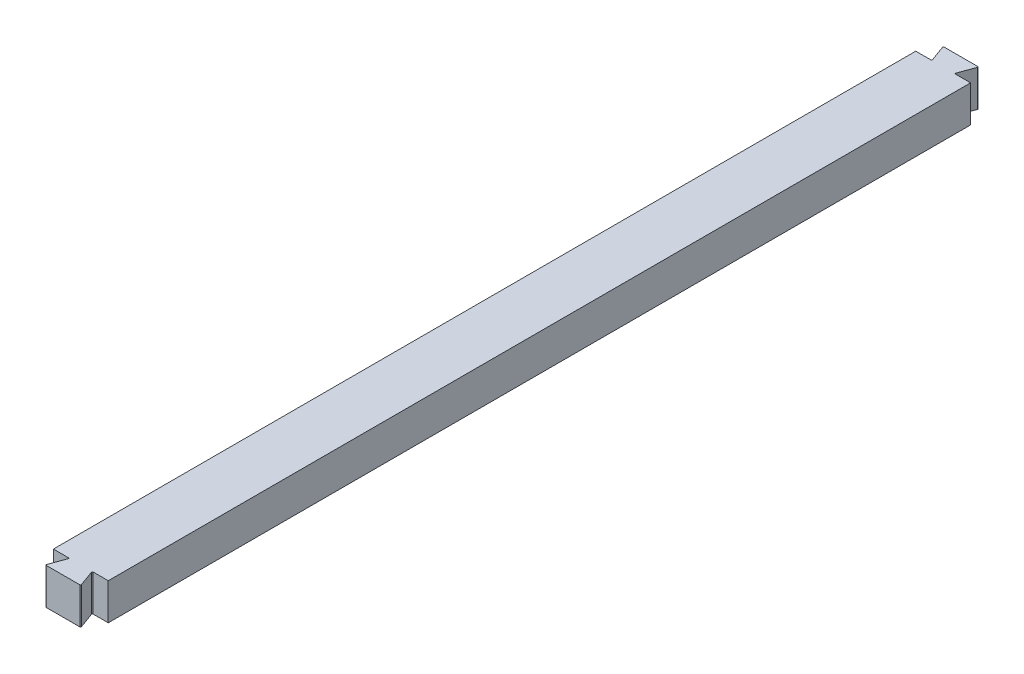
ISO-10303-21;
HEADER;
FILE_DESCRIPTION(('STEP AP214'),'2;1');
FILE_NAME('part.step','',(''),(''),'','','');
FILE_SCHEMA(('AUTOMOTIVE_DESIGN { 1 0 10303 214 1 1 1 1 }'));
ENDSEC;
DATA;
#1=APPLICATION_CONTEXT('core data for automotive mechanical design processes');
#2=APPLICATION_PROTOCOL_DEFINITION('international standard','automotive_design',2000,#1);
#3=PRODUCT_CONTEXT('',#1,'mechanical');
#4=PRODUCT('Part','Part','',(#3));
#5=PRODUCT_RELATED_PRODUCT_CATEGORY('part','',(#4));
#6=PRODUCT_DEFINITION_FORMATION('','',#4);
#7=PRODUCT_DEFINITION_CONTEXT('part definition',#1,'design');
#8=PRODUCT_DEFINITION('design','',#6,#7);
#9=PRODUCT_DEFINITION_SHAPE('','',#8);
#10=(LENGTH_UNIT() NAMED_UNIT(*) SI_UNIT(.MILLI.,.METRE.));
#11=(NAMED_UNIT(*) PLANE_ANGLE_UNIT() SI_UNIT($,.RADIAN.));
#12=(NAMED_UNIT(*) SI_UNIT($,.STERADIAN.) SOLID_ANGLE_UNIT());
#13=UNCERTAINTY_MEASURE_WITH_UNIT(LENGTH_MEASURE(1.E-05),#10,'distance_accuracy_value','');
#14=(GEOMETRIC_REPRESENTATION_CONTEXT(3) GLOBAL_UNCERTAINTY_ASSIGNED_CONTEXT((#13)) GLOBAL_UNIT_ASSIGNED_CONTEXT((#10,
#11,#12)) REPRESENTATION_CONTEXT('',''));
#15=CARTESIAN_POINT('',(0.,0.,0.));
#16=DIRECTION('',(0.,0.,1.));
#17=DIRECTION('',(1.,0.,0.));
#18=AXIS2_PLACEMENT_3D('',#15,#16,#17);
#19=CARTESIAN_POINT('',(0.,0.,-307.275));
#20=DIRECTION('',(0.,0.,-1.));
#21=DIRECTION('',(-1.,0.,0.));
#22=AXIS2_PLACEMENT_3D('',#19,#20,#21);
#23=PLANE('',#22);
#24=DIRECTION('',(-1.,0.,0.));
#25=VECTOR('',#24,1.);
#26=CARTESIAN_POINT('',(-357.675,0.,-307.275));
#27=LINE('',#26,#25);
#28=CARTESIAN_POINT('',(-367.675,0.,-307.275));
#29=VERTEX_POINT('',#28);
#30=CARTESIAN_POINT('',(-372.389370398652,0.,-307.275));
#31=VERTEX_POINT('',#30);
#32=EDGE_CURVE('E197',#29,#31,#27,.T.);
#33=ORIENTED_EDGE('',*,*,#32,.T.);
#34=DIRECTION('',(0.,1.,0.));
#35=VECTOR('',#34,1.);
#36=CARTESIAN_POINT('',(-372.389370398652,0.,-307.275));
#37=LINE('',#36,#35);
#38=CARTESIAN_POINT('',(-372.389370398652,11.31,-307.275));
#39=VERTEX_POINT('',#38);
#40=EDGE_CURVE('E326',#31,#39,#37,.T.);
#41=ORIENTED_EDGE('',*,*,#40,.T.);
#42=DIRECTION('',(-1.,0.,0.));
#43=VECTOR('',#42,1.);
#44=CARTESIAN_POINT('',(-357.675,11.31,-307.275));
#45=LINE('',#44,#43);
#46=CARTESIAN_POINT('',(-367.675,11.31,-307.275));
#47=VERTEX_POINT('',#46);
#48=EDGE_CURVE('E211',#47,#39,#45,.T.);
#49=ORIENTED_EDGE('',*,*,#48,.F.);
#50=DIRECTION('',(0.,1.,0.));
#51=VECTOR('',#50,1.);
#52=CARTESIAN_POINT('',(-367.675,2.9,-307.275));
#53=LINE('',#52,#51);
#54=EDGE_CURVE('E227',#29,#47,#53,.T.);
#55=ORIENTED_EDGE('',*,*,#54,.F.);
#56=EDGE_LOOP('',(#33,#41,#49,#55));
#57=FACE_BOUND('',#56,.T.);
#58=ADVANCED_FACE('F47',(#57),#23,.T.);
#59=CARTESIAN_POINT('',(0.,0.,-40.));
#60=DIRECTION('',(0.,0.,1.));
#61=DIRECTION('',(1.,0.,0.));
#62=AXIS2_PLACEMENT_3D('',#59,#60,#61);
#63=PLANE('',#62);
#64=DIRECTION('',(1.,0.,0.));
#65=VECTOR('',#64,1.);
#66=CARTESIAN_POINT('',(-357.675,0.,-40.));
#67=LINE('',#66,#65);
#68=CARTESIAN_POINT('',(-384.675,0.,-40.));
#69=VERTEX_POINT('',#68);
#70=CARTESIAN_POINT('',(-379.960629601348,0.,-40.));
#71=VERTEX_POINT('',#70);
#72=EDGE_CURVE('E205',#69,#71,#67,.T.);
#73=ORIENTED_EDGE('',*,*,#72,.T.);
#74=DIRECTION('',(0.,1.,0.));
#75=VECTOR('',#74,1.);
#76=CARTESIAN_POINT('',(-379.960629601348,11.31,-40.));
#77=LINE('',#76,#75);
#78=CARTESIAN_POINT('',(-379.960629601348,11.31,-40.));
#79=VERTEX_POINT('',#78);
#80=EDGE_CURVE('E238',#71,#79,#77,.T.);
#81=ORIENTED_EDGE('',*,*,#80,.T.);
#82=DIRECTION('',(1.,0.,0.));
#83=VECTOR('',#82,1.);
#84=CARTESIAN_POINT('',(-357.675,11.31,-40.));
#85=LINE('',#84,#83);
#86=CARTESIAN_POINT('',(-384.675,11.31,-40.));
#87=VERTEX_POINT('',#86);
#88=EDGE_CURVE('E249',#87,#79,#85,.T.);
#89=ORIENTED_EDGE('',*,*,#88,.F.);
#90=DIRECTION('',(0.,-1.,0.));
#91=VECTOR('',#90,1.);
#92=CARTESIAN_POINT('',(-384.675,2.9,-40.));
#93=LINE('',#92,#91);
#94=EDGE_CURVE('E217',#87,#69,#93,.T.);
#95=ORIENTED_EDGE('',*,*,#94,.T.);
#96=EDGE_LOOP('',(#73,#81,#89,#95));
#97=FACE_BOUND('',#96,.T.);
#98=ADVANCED_FACE('F437',(#97),#63,.T.);
#99=CARTESIAN_POINT('',(-372.389370398652,11.31,-40.));
#100=VERTEX_POINT('',#99);
#101=CARTESIAN_POINT('',(-367.675,11.31,-40.));
#102=VERTEX_POINT('',#101);
#103=EDGE_CURVE('E231',#100,#102,#85,.T.);
#104=ORIENTED_EDGE('',*,*,#103,.F.);
#105=DIRECTION('',(0.,1.,0.));
#106=VECTOR('',#105,1.);
#107=CARTESIAN_POINT('',(-372.389370398652,0.,-40.));
#108=LINE('',#107,#106);
#109=CARTESIAN_POINT('',(-372.389370398652,0.,-40.));
#110=VERTEX_POINT('',#109);
#111=EDGE_CURVE('E300',#100,#110,#108,.F.);
#112=ORIENTED_EDGE('',*,*,#111,.T.);
#113=CARTESIAN_POINT('',(-367.675,0.,-40.));
#114=VERTEX_POINT('',#113);
#115=EDGE_CURVE('E223',#110,#114,#67,.T.);
#116=ORIENTED_EDGE('',*,*,#115,.T.);
#117=DIRECTION('',(0.,-1.,0.));
#118=VECTOR('',#117,1.);
#119=CARTESIAN_POINT('',(-367.675,2.9,-40.));
#120=LINE('',#119,#118);
#121=EDGE_CURVE('E221',#102,#114,#120,.T.);
#122=ORIENTED_EDGE('',*,*,#121,.F.);
#123=EDGE_LOOP('',(#104,#112,#116,#122));
#124=FACE_BOUND('',#123,.T.);
#125=ADVANCED_FACE('F376',(#124),#63,.T.);
#126=CARTESIAN_POINT('',(-379.960629601348,11.31,-307.275));
#127=VERTEX_POINT('',#126);
#128=CARTESIAN_POINT('',(-384.675,11.31,-307.275));
#129=VERTEX_POINT('',#128);
#130=EDGE_CURVE('E235',#127,#129,#45,.T.);
#131=ORIENTED_EDGE('',*,*,#130,.F.);
#132=DIRECTION('',(0.,1.,0.));
#133=VECTOR('',#132,1.);
#134=CARTESIAN_POINT('',(-379.960629601348,0.,-307.275));
#135=LINE('',#134,#133);
#136=CARTESIAN_POINT('',(-379.960629601348,0.,-307.275));
#137=VERTEX_POINT('',#136);
#138=EDGE_CURVE('E194',#127,#137,#135,.F.);
#139=ORIENTED_EDGE('',*,*,#138,.T.);
#140=CARTESIAN_POINT('',(-384.675,0.,-307.275));
#141=VERTEX_POINT('',#140);
#142=EDGE_CURVE('E186',#137,#141,#27,.T.);
#143=ORIENTED_EDGE('',*,*,#142,.T.);
#144=DIRECTION('',(0.,1.,0.));
#145=VECTOR('',#144,1.);
#146=CARTESIAN_POINT('',(-384.675,2.9,-307.275));
#147=LINE('',#146,#145);
#148=EDGE_CURVE('E191',#141,#129,#147,.T.);
#149=ORIENTED_EDGE('',*,*,#148,.T.);
#150=EDGE_LOOP('',(#131,#139,#143,#149));
#151=FACE_BOUND('',#150,.T.);
#152=ADVANCED_FACE('F189',(#151),#23,.T.);
#153=CARTESIAN_POINT('',(-384.675,2.9,0.));
#154=DIRECTION('',(1.,0.,0.));
#155=DIRECTION('',(0.,0.,-1.));
#156=AXIS2_PLACEMENT_3D('',#153,#154,#155);
#157=PLANE('',#156);
#158=ORIENTED_EDGE('',*,*,#94,.F.);
#159=DIRECTION('',(0.,0.,-1.));
#160=VECTOR('',#159,1.);
#161=CARTESIAN_POINT('',(-384.675,11.31,0.));
#162=LINE('',#161,#160);
#163=EDGE_CURVE('E215',#87,#129,#162,.T.);
#164=ORIENTED_EDGE('',*,*,#163,.T.);
#165=ORIENTED_EDGE('',*,*,#148,.F.);
#166=DIRECTION('',(0.,0.,1.));
#167=VECTOR('',#166,1.);
#168=CARTESIAN_POINT('',(-384.675,0.,0.));
#169=LINE('',#168,#167);
#170=EDGE_CURVE('E201',#141,#69,#169,.T.);
#171=ORIENTED_EDGE('',*,*,#170,.T.);
#172=EDGE_LOOP('',(#158,#164,#165,#171));
#173=FACE_BOUND('',#172,.T.);
#174=ADVANCED_FACE('F213',(#173),#157,.F.);
#175=CARTESIAN_POINT('',(-367.675,2.9,-17.));
#176=DIRECTION('',(1.,0.,0.));
#177=DIRECTION('',(0.,0.,-1.));
#178=AXIS2_PLACEMENT_3D('',#175,#176,#177);
#179=PLANE('',#178);
#180=DIRECTION('',(0.,0.,1.));
#181=VECTOR('',#180,1.);
#182=CARTESIAN_POINT('',(-367.675,11.31,-17.));
#183=LINE('',#182,#181);
#184=EDGE_CURVE('E239',#47,#102,#183,.T.);
#185=ORIENTED_EDGE('',*,*,#184,.T.);
#186=ORIENTED_EDGE('',*,*,#121,.T.);
#187=DIRECTION('',(0.,0.,1.));
#188=VECTOR('',#187,1.);
#189=CARTESIAN_POINT('',(-367.675,0.,-17.));
#190=LINE('',#189,#188);
#191=EDGE_CURVE('E210',#29,#114,#190,.T.);
#192=ORIENTED_EDGE('',*,*,#191,.F.);
#193=ORIENTED_EDGE('',*,*,#54,.T.);
#194=EDGE_LOOP('',(#185,#186,#192,#193));
#195=FACE_BOUND('',#194,.T.);
#196=ADVANCED_FACE('F379',(#195),#179,.T.);
#197=CARTESIAN_POINT('',(-357.675,0.,-330.275));
#198=DIRECTION('',(0.,1.,0.));
#199=DIRECTION('',(0.,0.,1.));
#200=AXIS2_PLACEMENT_3D('',#197,#198,#199);
#201=PLANE('',#200);
#202=DIRECTION('',(-1.,0.,0.));
#203=VECTOR('',#202,1.);
#204=CARTESIAN_POINT('',(-381.675,0.,-34.5050451610908));
#205=LINE('',#204,#203);
#206=CARTESIAN_POINT('',(-370.960629601348,0.,-34.5050451610908));
#207=VERTEX_POINT('',#206);
#208=CARTESIAN_POINT('',(-381.389370398652,0.,-34.5050451610908));
#209=VERTEX_POINT('',#208);
#210=EDGE_CURVE('E414',#207,#209,#205,.T.);
#211=ORIENTED_EDGE('',*,*,#210,.T.);
#212=CARTESIAN_POINT('',(-381.389370398652,0.,-34.7050451610908));
#213=DIRECTION('',(0.,1.,0.));
#214=DIRECTION('',(0.,0.,1.));
#215=AXIS2_PLACEMENT_3D('',#212,#213,#214);
#216=CIRCLE('',#215,0.2);
#217=CARTESIAN_POINT('',(-381.577308922809,0.,-34.773449189756));
#218=VERTEX_POINT('',#217);
#219=EDGE_CURVE('E291',#209,#218,#216,.F.);
#220=ORIENTED_EDGE('',*,*,#219,.T.);
#221=DIRECTION('',(0.342020143325674,0.,-0.939692620785906));
#222=VECTOR('',#221,1.);
#223=CARTESIAN_POINT('',(-379.675,0.,-40.));
#224=LINE('',#223,#222);
#225=CARTESIAN_POINT('',(-379.772691077191,0.,-39.7315959713349));
#226=VERTEX_POINT('',#225);
#227=EDGE_CURVE('E198',#218,#226,#224,.T.);
#228=ORIENTED_EDGE('',*,*,#227,.T.);
#229=CARTESIAN_POINT('',(-379.960629601348,0.,-39.8));
#230=DIRECTION('',(0.,1.,0.));
#231=DIRECTION('',(0.,0.,1.));
#232=AXIS2_PLACEMENT_3D('',#229,#230,#231);
#233=CIRCLE('',#232,0.2);
#234=EDGE_CURVE('E333',#226,#71,#233,.T.);
#235=ORIENTED_EDGE('',*,*,#234,.T.);
#236=ORIENTED_EDGE('',*,*,#72,.F.);
#237=ORIENTED_EDGE('',*,*,#170,.F.);
#238=ORIENTED_EDGE('',*,*,#142,.F.);
#239=CARTESIAN_POINT('',(-379.960629601348,0.,-307.475));
#240=DIRECTION('',(0.,1.,0.));
#241=DIRECTION('',(0.,0.,1.));
#242=AXIS2_PLACEMENT_3D('',#239,#240,#241);
#243=CIRCLE('',#242,0.2);
#244=CARTESIAN_POINT('',(-379.772691077191,0.,-307.543404028665));
#245=VERTEX_POINT('',#244);
#246=EDGE_CURVE('E344',#137,#245,#243,.T.);
#247=ORIENTED_EDGE('',*,*,#246,.T.);
#248=DIRECTION('',(0.342020143325674,0.,0.939692620785907));
#249=VECTOR('',#248,1.);
#250=CARTESIAN_POINT('',(-379.675,0.,-307.275));
#251=LINE('',#250,#249);
#252=CARTESIAN_POINT('',(-381.577308922809,0.,-312.501550810244));
#253=VERTEX_POINT('',#252);
#254=EDGE_CURVE('E389',#253,#245,#251,.T.);
#255=ORIENTED_EDGE('',*,*,#254,.F.);
#256=CARTESIAN_POINT('',(-381.389370398652,0.,-312.569954838909));
#257=DIRECTION('',(0.,1.,0.));
#258=DIRECTION('',(0.,0.,1.));
#259=AXIS2_PLACEMENT_3D('',#256,#257,#258);
#260=CIRCLE('',#259,0.2);
#261=CARTESIAN_POINT('',(-381.389370398652,0.,-312.769954838909));
#262=VERTEX_POINT('',#261);
#263=EDGE_CURVE('E285',#253,#262,#260,.F.);
#264=ORIENTED_EDGE('',*,*,#263,.T.);
#265=DIRECTION('',(-1.,0.,0.));
#266=VECTOR('',#265,1.);
#267=CARTESIAN_POINT('',(-381.675,0.,-312.769954838909));
#268=LINE('',#267,#266);
#269=CARTESIAN_POINT('',(-370.960629601348,0.,-312.769954838909));
#270=VERTEX_POINT('',#269);
#271=EDGE_CURVE('E397',#270,#262,#268,.T.);
#272=ORIENTED_EDGE('',*,*,#271,.F.);
#273=CARTESIAN_POINT('',(-370.960629601348,0.,-312.569954838909));
#274=DIRECTION('',(0.,1.,0.));
#275=DIRECTION('',(0.,0.,1.));
#276=AXIS2_PLACEMENT_3D('',#273,#274,#275);
#277=CIRCLE('',#276,0.2);
#278=CARTESIAN_POINT('',(-370.772691077191,0.,-312.501550810244));
#279=VERTEX_POINT('',#278);
#280=EDGE_CURVE('E282',#270,#279,#277,.F.);
#281=ORIENTED_EDGE('',*,*,#280,.T.);
#282=DIRECTION('',(0.342020143325674,0.,-0.939692620785906));
#283=VECTOR('',#282,1.);
#284=CARTESIAN_POINT('',(-370.675,0.,-312.769954838909));
#285=LINE('',#284,#283);
#286=CARTESIAN_POINT('',(-372.577308922809,0.,-307.543404028665));
#287=VERTEX_POINT('',#286);
#288=EDGE_CURVE('E368',#287,#279,#285,.T.);
#289=ORIENTED_EDGE('',*,*,#288,.F.);
#290=CARTESIAN_POINT('',(-372.389370398652,0.,-307.475));
#291=DIRECTION('',(0.,1.,0.));
#292=DIRECTION('',(0.,0.,1.));
#293=AXIS2_PLACEMENT_3D('',#290,#291,#292);
#294=CIRCLE('',#293,0.2);
#295=EDGE_CURVE('E11',#287,#31,#294,.T.);
#296=ORIENTED_EDGE('',*,*,#295,.T.);
#297=ORIENTED_EDGE('',*,*,#32,.F.);
#298=ORIENTED_EDGE('',*,*,#191,.T.);
#299=ORIENTED_EDGE('',*,*,#115,.F.);
#300=CARTESIAN_POINT('',(-372.389370398652,0.,-39.8));
#301=DIRECTION('',(0.,1.,0.));
#302=DIRECTION('',(0.,0.,1.));
#303=AXIS2_PLACEMENT_3D('',#300,#301,#302);
#304=CIRCLE('',#303,0.2);
#305=CARTESIAN_POINT('',(-372.577308922809,0.,-39.7315959713349));
#306=VERTEX_POINT('',#305);
#307=EDGE_CURVE('E70',#110,#306,#304,.T.);
#308=ORIENTED_EDGE('',*,*,#307,.T.);
#309=DIRECTION('',(0.342020143325674,0.,0.939692620785906));
#310=VECTOR('',#309,1.);
#311=CARTESIAN_POINT('',(-370.675,0.,-34.5050451610908));
#312=LINE('',#311,#310);
#313=CARTESIAN_POINT('',(-370.772691077191,0.,-34.773449189756));
#314=VERTEX_POINT('',#313);
#315=EDGE_CURVE('E417',#306,#314,#312,.T.);
#316=ORIENTED_EDGE('',*,*,#315,.T.);
#317=CARTESIAN_POINT('',(-370.960629601348,0.,-34.7050451610908));
#318=DIRECTION('',(0.,1.,0.));
#319=DIRECTION('',(0.,0.,1.));
#320=AXIS2_PLACEMENT_3D('',#317,#318,#319);
#321=CIRCLE('',#320,0.2);
#322=EDGE_CURVE('E288',#314,#207,#321,.F.);
#323=ORIENTED_EDGE('',*,*,#322,.T.);
#324=EDGE_LOOP('',(#211,#220,#228,#235,#236,#237,#238,#247,#255,#264,#272,#281,#289,#296,#297,
#298,#299,#308,#316,#323));
#325=FACE_BOUND('',#324,.T.);
#326=ADVANCED_FACE('F203',(#325),#201,.F.);
#327=CARTESIAN_POINT('',(-357.675,11.31,-330.275));
#328=DIRECTION('',(0.,1.,0.));
#329=DIRECTION('',(0.,0.,1.));
#330=AXIS2_PLACEMENT_3D('',#327,#328,#329);
#331=PLANE('',#330);
#332=DIRECTION('',(-0.342020143325674,0.,0.939692620785907));
#333=VECTOR('',#332,1.);
#334=CARTESIAN_POINT('',(-379.675,11.31,-40.));
#335=LINE('',#334,#333);
#336=CARTESIAN_POINT('',(-379.772691077191,11.31,-39.7315959713349));
#337=VERTEX_POINT('',#336);
#338=CARTESIAN_POINT('',(-381.577308922809,11.31,-34.773449189756));
#339=VERTEX_POINT('',#338);
#340=EDGE_CURVE('E396',#337,#339,#335,.T.);
#341=ORIENTED_EDGE('',*,*,#340,.T.);
#342=CARTESIAN_POINT('',(-381.389370398652,11.31,-34.7050451610908));
#343=DIRECTION('',(0.,1.,0.));
#344=DIRECTION('',(0.,0.,1.));
#345=AXIS2_PLACEMENT_3D('',#342,#343,#344);
#346=CIRCLE('',#345,0.2);
#347=CARTESIAN_POINT('',(-381.389370398652,11.31,-34.5050451610908));
#348=VERTEX_POINT('',#347);
#349=EDGE_CURVE('E272',#339,#348,#346,.T.);
#350=ORIENTED_EDGE('',*,*,#349,.T.);
#351=DIRECTION('',(1.,0.,0.));
#352=VECTOR('',#351,1.);
#353=CARTESIAN_POINT('',(-381.675,11.31,-34.5050451610908));
#354=LINE('',#353,#352);
#355=CARTESIAN_POINT('',(-370.960629601348,11.31,-34.5050451610908));
#356=VERTEX_POINT('',#355);
#357=EDGE_CURVE('E401',#348,#356,#354,.T.);
#358=ORIENTED_EDGE('',*,*,#357,.T.);
#359=CARTESIAN_POINT('',(-370.960629601348,11.31,-34.7050451610908));
#360=DIRECTION('',(0.,1.,0.));
#361=DIRECTION('',(0.,0.,1.));
#362=AXIS2_PLACEMENT_3D('',#359,#360,#361);
#363=CIRCLE('',#362,0.2);
#364=CARTESIAN_POINT('',(-370.772691077191,11.31,-34.773449189756));
#365=VERTEX_POINT('',#364);
#366=EDGE_CURVE('E269',#356,#365,#363,.T.);
#367=ORIENTED_EDGE('',*,*,#366,.T.);
#368=DIRECTION('',(-0.342020143325674,0.,-0.939692620785906));
#369=VECTOR('',#368,1.);
#370=CARTESIAN_POINT('',(-370.675,11.31,-34.5050451610908));
#371=LINE('',#370,#369);
#372=CARTESIAN_POINT('',(-372.577308922809,11.31,-39.7315959713349));
#373=VERTEX_POINT('',#372);
#374=EDGE_CURVE('E418',#365,#373,#371,.T.);
#375=ORIENTED_EDGE('',*,*,#374,.T.);
#376=CARTESIAN_POINT('',(-372.389370398652,11.31,-39.8));
#377=DIRECTION('',(0.,1.,0.));
#378=DIRECTION('',(0.,0.,1.));
#379=AXIS2_PLACEMENT_3D('',#376,#377,#378);
#380=CIRCLE('',#379,0.2);
#381=EDGE_CURVE('E336',#373,#100,#380,.F.);
#382=ORIENTED_EDGE('',*,*,#381,.T.);
#383=ORIENTED_EDGE('',*,*,#103,.T.);
#384=ORIENTED_EDGE('',*,*,#184,.F.);
#385=ORIENTED_EDGE('',*,*,#48,.T.);
#386=CARTESIAN_POINT('',(-372.389370398652,11.31,-307.475));
#387=DIRECTION('',(0.,1.,0.));
#388=DIRECTION('',(0.,0.,1.));
#389=AXIS2_PLACEMENT_3D('',#386,#387,#388);
#390=CIRCLE('',#389,0.2);
#391=CARTESIAN_POINT('',(-372.577308922809,11.31,-307.543404028665));
#392=VERTEX_POINT('',#391);
#393=EDGE_CURVE('E56',#39,#392,#390,.F.);
#394=ORIENTED_EDGE('',*,*,#393,.T.);
#395=DIRECTION('',(-0.342020143325674,0.,0.939692620785906));
#396=VECTOR('',#395,1.);
#397=CARTESIAN_POINT('',(-370.675,11.31,-312.769954838909));
#398=LINE('',#397,#396);
#399=CARTESIAN_POINT('',(-370.772691077191,11.31,-312.501550810244));
#400=VERTEX_POINT('',#399);
#401=EDGE_CURVE('E352',#400,#392,#398,.T.);
#402=ORIENTED_EDGE('',*,*,#401,.F.);
#403=CARTESIAN_POINT('',(-370.960629601348,11.31,-312.569954838909));
#404=DIRECTION('',(0.,1.,0.));
#405=DIRECTION('',(0.,0.,1.));
#406=AXIS2_PLACEMENT_3D('',#403,#404,#405);
#407=CIRCLE('',#406,0.2);
#408=CARTESIAN_POINT('',(-370.960629601348,11.31,-312.769954838909));
#409=VERTEX_POINT('',#408);
#410=EDGE_CURVE('E263',#400,#409,#407,.T.);
#411=ORIENTED_EDGE('',*,*,#410,.T.);
#412=DIRECTION('',(1.,0.,0.));
#413=VECTOR('',#412,1.);
#414=CARTESIAN_POINT('',(-381.675,11.31,-312.769954838909));
#415=LINE('',#414,#413);
#416=CARTESIAN_POINT('',(-381.389370398652,11.31,-312.769954838909));
#417=VERTEX_POINT('',#416);
#418=EDGE_CURVE('E363',#417,#409,#415,.T.);
#419=ORIENTED_EDGE('',*,*,#418,.F.);
#420=CARTESIAN_POINT('',(-381.389370398652,11.31,-312.569954838909));
#421=DIRECTION('',(0.,1.,0.));
#422=DIRECTION('',(0.,0.,1.));
#423=AXIS2_PLACEMENT_3D('',#420,#421,#422);
#424=CIRCLE('',#423,0.2);
#425=CARTESIAN_POINT('',(-381.577308922809,11.31,-312.501550810244));
#426=VERTEX_POINT('',#425);
#427=EDGE_CURVE('E266',#417,#426,#424,.T.);
#428=ORIENTED_EDGE('',*,*,#427,.T.);
#429=DIRECTION('',(-0.342020143325674,0.,-0.939692620785907));
#430=VECTOR('',#429,1.);
#431=CARTESIAN_POINT('',(-379.675,11.31,-307.275));
#432=LINE('',#431,#430);
#433=CARTESIAN_POINT('',(-379.772691077191,11.31,-307.543404028665));
#434=VERTEX_POINT('',#433);
#435=EDGE_CURVE('E409',#434,#426,#432,.T.);
#436=ORIENTED_EDGE('',*,*,#435,.F.);
#437=CARTESIAN_POINT('',(-379.960629601348,11.31,-307.475));
#438=DIRECTION('',(0.,1.,0.));
#439=DIRECTION('',(0.,0.,1.));
#440=AXIS2_PLACEMENT_3D('',#437,#438,#439);
#441=CIRCLE('',#440,0.2);
#442=EDGE_CURVE('E341',#434,#127,#441,.F.);
#443=ORIENTED_EDGE('',*,*,#442,.T.);
#444=ORIENTED_EDGE('',*,*,#130,.T.);
#445=ORIENTED_EDGE('',*,*,#163,.F.);
#446=ORIENTED_EDGE('',*,*,#88,.T.);
#447=CARTESIAN_POINT('',(-379.960629601348,11.31,-39.8));
#448=DIRECTION('',(0.,1.,0.));
#449=DIRECTION('',(0.,0.,1.));
#450=AXIS2_PLACEMENT_3D('',#447,#448,#449);
#451=CIRCLE('',#450,0.2);
#452=EDGE_CURVE('E330',#79,#337,#451,.F.);
#453=ORIENTED_EDGE('',*,*,#452,.T.);
#454=EDGE_LOOP('',(#341,#350,#358,#367,#375,#382,#383,#384,#385,#394,#402,#411,#419,#428,#436,
#443,#444,#445,#446,#453));
#455=FACE_BOUND('',#454,.T.);
#456=ADVANCED_FACE('F351',(#455),#331,.T.);
#457=CARTESIAN_POINT('',(-370.675,-12.2961184396399,-34.5050451610908));
#458=DIRECTION('',(0.939692620785906,0.,-0.342020143325674));
#459=DIRECTION('',(-0.342020143325674,0.,-0.939692620785906));
#460=AXIS2_PLACEMENT_3D('',#457,#458,#459);
#461=PLANE('',#460);
#462=ORIENTED_EDGE('',*,*,#374,.F.);
#463=DIRECTION('',(0.,1.,0.));
#464=VECTOR('',#463,1.);
#465=CARTESIAN_POINT('',(-370.772691077191,-12.2961184396399,-34.773449189756));
#466=LINE('',#465,#464);
#467=EDGE_CURVE('E63',#365,#314,#466,.F.);
#468=ORIENTED_EDGE('',*,*,#467,.T.);
#469=ORIENTED_EDGE('',*,*,#315,.F.);
#470=DIRECTION('',(0.,1.,0.));
#471=VECTOR('',#470,1.);
#472=CARTESIAN_POINT('',(-372.577308922809,11.31,-39.7315959713349));
#473=LINE('',#472,#471);
#474=EDGE_CURVE('E294',#306,#373,#473,.T.);
#475=ORIENTED_EDGE('',*,*,#474,.T.);
#476=EDGE_LOOP('',(#462,#468,#469,#475));
#477=FACE_BOUND('',#476,.T.);
#478=ADVANCED_FACE('F451',(#477),#461,.T.);
#479=CARTESIAN_POINT('',(-381.675,-12.2961184396399,-34.5050451610908));
#480=DIRECTION('',(0.,0.,1.));
#481=DIRECTION('',(1.,0.,0.));
#482=AXIS2_PLACEMENT_3D('',#479,#480,#481);
#483=PLANE('',#482);
#484=ORIENTED_EDGE('',*,*,#357,.F.);
#485=DIRECTION('',(0.,1.,0.));
#486=VECTOR('',#485,1.);
#487=CARTESIAN_POINT('',(-381.389370398652,-12.2961184396399,-34.5050451610908));
#488=LINE('',#487,#486);
#489=EDGE_CURVE('E279',#348,#209,#488,.F.);
#490=ORIENTED_EDGE('',*,*,#489,.T.);
#491=ORIENTED_EDGE('',*,*,#210,.F.);
#492=DIRECTION('',(0.,1.,0.));
#493=VECTOR('',#492,1.);
#494=CARTESIAN_POINT('',(-370.960629601348,-12.2961184396399,-34.5050451610908));
#495=LINE('',#494,#493);
#496=EDGE_CURVE('E275',#207,#356,#495,.T.);
#497=ORIENTED_EDGE('',*,*,#496,.T.);
#498=EDGE_LOOP('',(#484,#490,#491,#497));
#499=FACE_BOUND('',#498,.T.);
#500=ADVANCED_FACE('F445',(#499),#483,.T.);
#501=CARTESIAN_POINT('',(-379.675,-12.2961184396399,-40.));
#502=DIRECTION('',(-0.939692620785906,0.,-0.342020143325674));
#503=DIRECTION('',(-0.342020143325674,0.,0.939692620785906));
#504=AXIS2_PLACEMENT_3D('',#501,#502,#503);
#505=PLANE('',#504);
#506=ORIENTED_EDGE('',*,*,#340,.F.);
#507=DIRECTION('',(0.,1.,0.));
#508=VECTOR('',#507,1.);
#509=CARTESIAN_POINT('',(-379.772691077191,0.,-39.7315959713349));
#510=LINE('',#509,#508);
#511=EDGE_CURVE('E260',#337,#226,#510,.F.);
#512=ORIENTED_EDGE('',*,*,#511,.T.);
#513=ORIENTED_EDGE('',*,*,#227,.F.);
#514=DIRECTION('',(0.,1.,0.));
#515=VECTOR('',#514,1.);
#516=CARTESIAN_POINT('',(-381.577308922809,-12.2961184396399,-34.773449189756));
#517=LINE('',#516,#515);
#518=EDGE_CURVE('E256',#218,#339,#517,.T.);
#519=ORIENTED_EDGE('',*,*,#518,.T.);
#520=EDGE_LOOP('',(#506,#512,#513,#519));
#521=FACE_BOUND('',#520,.T.);
#522=ADVANCED_FACE('F439',(#521),#505,.T.);
#523=CARTESIAN_POINT('',(-370.675,-12.2961184396399,-312.769954838909));
#524=DIRECTION('',(-0.939692620785906,0.,-0.342020143325674));
#525=DIRECTION('',(-0.342020143325674,0.,0.939692620785906));
#526=AXIS2_PLACEMENT_3D('',#523,#524,#525);
#527=PLANE('',#526);
#528=ORIENTED_EDGE('',*,*,#288,.T.);
#529=DIRECTION('',(0.,1.,0.));
#530=VECTOR('',#529,1.);
#531=CARTESIAN_POINT('',(-370.772691077191,-12.2961184396399,-312.501550810244));
#532=LINE('',#531,#530);
#533=EDGE_CURVE('E322',#279,#400,#532,.T.);
#534=ORIENTED_EDGE('',*,*,#533,.T.);
#535=ORIENTED_EDGE('',*,*,#401,.T.);
#536=DIRECTION('',(0.,1.,0.));
#537=VECTOR('',#536,1.);
#538=CARTESIAN_POINT('',(-372.577308922809,-12.2961184396399,-307.543404028665));
#539=LINE('',#538,#537);
#540=EDGE_CURVE('E319',#392,#287,#539,.F.);
#541=ORIENTED_EDGE('',*,*,#540,.T.);
#542=EDGE_LOOP('',(#528,#534,#535,#541));
#543=FACE_BOUND('',#542,.T.);
#544=ADVANCED_FACE('F359',(#543),#527,.F.);
#545=CARTESIAN_POINT('',(-381.675,-12.2961184396399,-312.769954838909));
#546=DIRECTION('',(0.,0.,1.));
#547=DIRECTION('',(1.,0.,0.));
#548=AXIS2_PLACEMENT_3D('',#545,#546,#547);
#549=PLANE('',#548);
#550=ORIENTED_EDGE('',*,*,#271,.T.);
#551=DIRECTION('',(0.,1.,0.));
#552=VECTOR('',#551,1.);
#553=CARTESIAN_POINT('',(-381.389370398652,-12.2961184396399,-312.769954838909));
#554=LINE('',#553,#552);
#555=EDGE_CURVE('E315',#262,#417,#554,.T.);
#556=ORIENTED_EDGE('',*,*,#555,.T.);
#557=ORIENTED_EDGE('',*,*,#418,.T.);
#558=DIRECTION('',(0.,1.,0.));
#559=VECTOR('',#558,1.);
#560=CARTESIAN_POINT('',(-370.960629601348,-12.2961184396399,-312.769954838909));
#561=LINE('',#560,#559);
#562=EDGE_CURVE('E312',#409,#270,#561,.F.);
#563=ORIENTED_EDGE('',*,*,#562,.T.);
#564=EDGE_LOOP('',(#550,#556,#557,#563));
#565=FACE_BOUND('',#564,.T.);
#566=ADVANCED_FACE('F493',(#565),#549,.F.);
#567=CARTESIAN_POINT('',(-379.675,-12.2961184396399,-307.275));
#568=DIRECTION('',(0.939692620785907,0.,-0.342020143325674));
#569=DIRECTION('',(-0.342020143325674,0.,-0.939692620785907));
#570=AXIS2_PLACEMENT_3D('',#567,#568,#569);
#571=PLANE('',#570);
#572=ORIENTED_EDGE('',*,*,#254,.T.);
#573=DIRECTION('',(0.,1.,0.));
#574=VECTOR('',#573,1.);
#575=CARTESIAN_POINT('',(-379.772691077191,-12.2961184396399,-307.543404028665));
#576=LINE('',#575,#574);
#577=EDGE_CURVE('E306',#245,#434,#576,.T.);
#578=ORIENTED_EDGE('',*,*,#577,.T.);
#579=ORIENTED_EDGE('',*,*,#435,.T.);
#580=DIRECTION('',(0.,1.,0.));
#581=VECTOR('',#580,1.);
#582=CARTESIAN_POINT('',(-381.577308922809,-12.2961184396399,-312.501550810244));
#583=LINE('',#582,#581);
#584=EDGE_CURVE('E303',#426,#253,#583,.F.);
#585=ORIENTED_EDGE('',*,*,#584,.T.);
#586=EDGE_LOOP('',(#572,#578,#579,#585));
#587=FACE_BOUND('',#586,.T.);
#588=ADVANCED_FACE('F392',(#587),#571,.F.);
#589=CARTESIAN_POINT('',(-379.960629601348,0.,-39.8));
#590=DIRECTION('',(0.,-1.,0.));
#591=DIRECTION('',(0.,0.,-1.));
#592=AXIS2_PLACEMENT_3D('',#589,#590,#591);
#593=CYLINDRICAL_SURFACE('',#592,0.2);
#594=ORIENTED_EDGE('',*,*,#234,.F.);
#595=ORIENTED_EDGE('',*,*,#511,.F.);
#596=ORIENTED_EDGE('',*,*,#452,.F.);
#597=ORIENTED_EDGE('',*,*,#80,.F.);
#598=EDGE_LOOP('',(#594,#595,#596,#597));
#599=FACE_BOUND('',#598,.T.);
#600=ADVANCED_FACE('F435',(#599),#593,.F.);
#601=CARTESIAN_POINT('',(-381.389370398652,-12.2961184396399,-34.7050451610908));
#602=DIRECTION('',(0.,1.,0.));
#603=DIRECTION('',(0.,0.,1.));
#604=AXIS2_PLACEMENT_3D('',#601,#602,#603);
#605=CYLINDRICAL_SURFACE('',#604,0.2);
#606=ORIENTED_EDGE('',*,*,#219,.F.);
#607=ORIENTED_EDGE('',*,*,#489,.F.);
#608=ORIENTED_EDGE('',*,*,#349,.F.);
#609=ORIENTED_EDGE('',*,*,#518,.F.);
#610=EDGE_LOOP('',(#606,#607,#608,#609));
#611=FACE_BOUND('',#610,.T.);
#612=ADVANCED_FACE('F441',(#611),#605,.T.);
#613=CARTESIAN_POINT('',(-370.960629601348,-12.2961184396399,-34.7050451610908));
#614=DIRECTION('',(0.,1.,0.));
#615=DIRECTION('',(0.,0.,1.));
#616=AXIS2_PLACEMENT_3D('',#613,#614,#615);
#617=CYLINDRICAL_SURFACE('',#616,0.2);
#618=ORIENTED_EDGE('',*,*,#322,.F.);
#619=ORIENTED_EDGE('',*,*,#467,.F.);
#620=ORIENTED_EDGE('',*,*,#366,.F.);
#621=ORIENTED_EDGE('',*,*,#496,.F.);
#622=EDGE_LOOP('',(#618,#619,#620,#621));
#623=FACE_BOUND('',#622,.T.);
#624=ADVANCED_FACE('F450',(#623),#617,.T.);
#625=CARTESIAN_POINT('',(-372.389370398652,-12.2961184396399,-39.8));
#626=DIRECTION('',(0.,-1.,0.));
#627=DIRECTION('',(0.,0.,-1.));
#628=AXIS2_PLACEMENT_3D('',#625,#626,#627);
#629=CYLINDRICAL_SURFACE('',#628,0.2);
#630=ORIENTED_EDGE('',*,*,#307,.F.);
#631=ORIENTED_EDGE('',*,*,#111,.F.);
#632=ORIENTED_EDGE('',*,*,#381,.F.);
#633=ORIENTED_EDGE('',*,*,#474,.F.);
#634=EDGE_LOOP('',(#630,#631,#632,#633));
#635=FACE_BOUND('',#634,.T.);
#636=ADVANCED_FACE('F454',(#635),#629,.F.);
#637=CARTESIAN_POINT('',(-379.960629601348,-12.2961184396399,-307.475));
#638=DIRECTION('',(0.,1.,0.));
#639=DIRECTION('',(0.,0.,1.));
#640=AXIS2_PLACEMENT_3D('',#637,#638,#639);
#641=CYLINDRICAL_SURFACE('',#640,0.2);
#642=ORIENTED_EDGE('',*,*,#246,.F.);
#643=ORIENTED_EDGE('',*,*,#138,.F.);
#644=ORIENTED_EDGE('',*,*,#442,.F.);
#645=ORIENTED_EDGE('',*,*,#577,.F.);
#646=EDGE_LOOP('',(#642,#643,#644,#645));
#647=FACE_BOUND('',#646,.T.);
#648=ADVANCED_FACE('F385',(#647),#641,.F.);
#649=CARTESIAN_POINT('',(-381.389370398652,-12.2961184396399,-312.569954838909));
#650=DIRECTION('',(0.,1.,0.));
#651=DIRECTION('',(0.,0.,1.));
#652=AXIS2_PLACEMENT_3D('',#649,#650,#651);
#653=CYLINDRICAL_SURFACE('',#652,0.2);
#654=ORIENTED_EDGE('',*,*,#263,.F.);
#655=ORIENTED_EDGE('',*,*,#584,.F.);
#656=ORIENTED_EDGE('',*,*,#427,.F.);
#657=ORIENTED_EDGE('',*,*,#555,.F.);
#658=EDGE_LOOP('',(#654,#655,#656,#657));
#659=FACE_BOUND('',#658,.T.);
#660=ADVANCED_FACE('F461',(#659),#653,.T.);
#661=CARTESIAN_POINT('',(-370.960629601348,-12.2961184396399,-312.569954838909));
#662=DIRECTION('',(0.,1.,0.));
#663=DIRECTION('',(0.,0.,1.));
#664=AXIS2_PLACEMENT_3D('',#661,#662,#663);
#665=CYLINDRICAL_SURFACE('',#664,0.2);
#666=ORIENTED_EDGE('',*,*,#280,.F.);
#667=ORIENTED_EDGE('',*,*,#562,.F.);
#668=ORIENTED_EDGE('',*,*,#410,.F.);
#669=ORIENTED_EDGE('',*,*,#533,.F.);
#670=EDGE_LOOP('',(#666,#667,#668,#669));
#671=FACE_BOUND('',#670,.T.);
#672=ADVANCED_FACE('F509',(#671),#665,.T.);
#673=CARTESIAN_POINT('',(-372.389370398652,0.,-307.475));
#674=DIRECTION('',(0.,1.,0.));
#675=DIRECTION('',(0.,0.,1.));
#676=AXIS2_PLACEMENT_3D('',#673,#674,#675);
#677=CYLINDRICAL_SURFACE('',#676,0.2);
#678=ORIENTED_EDGE('',*,*,#295,.F.);
#679=ORIENTED_EDGE('',*,*,#540,.F.);
#680=ORIENTED_EDGE('',*,*,#393,.F.);
#681=ORIENTED_EDGE('',*,*,#40,.F.);
#682=EDGE_LOOP('',(#678,#679,#680,#681));
#683=FACE_BOUND('',#682,.T.);
#684=ADVANCED_FACE('F49',(#683),#677,.F.);
#685=CLOSED_SHELL('',(#58,#98,#125,#152,#174,#196,#326,#456,#478,#500,#522,#544,#566,#588,#600,
#612,#624,#636,#648,#660,#672,#684));
#686=MANIFOLD_SOLID_BREP('B2',#685);
#687=ADVANCED_BREP_SHAPE_REPRESENTATION('',(#18,#686),#14);
#688=SHAPE_DEFINITION_REPRESENTATION(#9,#687);
ENDSEC;
END-ISO-10303-21;
